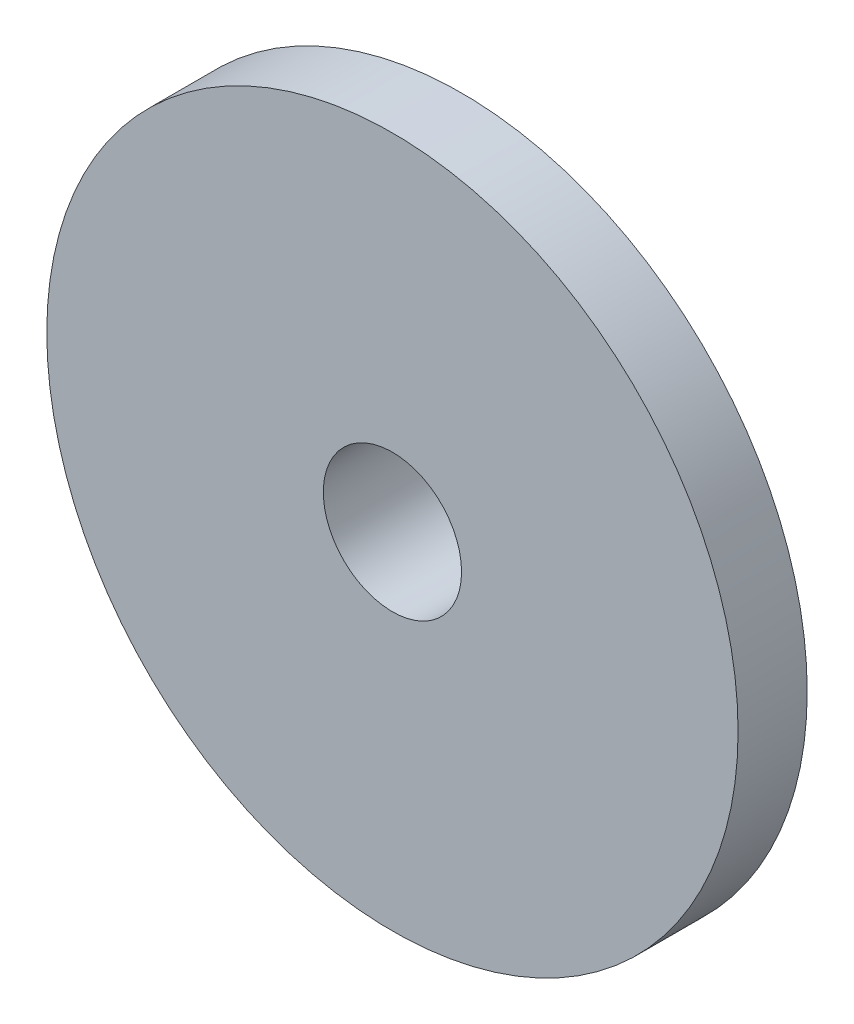
ISO-10303-21;
HEADER;
FILE_DESCRIPTION(('STEP AP214'),'2;1');
FILE_NAME('part.step','',(''),(''),'','','');
FILE_SCHEMA(('AUTOMOTIVE_DESIGN { 1 0 10303 214 1 1 1 1 }'));
ENDSEC;
DATA;
#1=APPLICATION_CONTEXT('core data for automotive mechanical design processes');
#2=APPLICATION_PROTOCOL_DEFINITION('international standard','automotive_design',2000,#1);
#3=PRODUCT_CONTEXT('',#1,'mechanical');
#4=PRODUCT('Part','Part','',(#3));
#5=PRODUCT_RELATED_PRODUCT_CATEGORY('part','',(#4));
#6=PRODUCT_DEFINITION_FORMATION('','',#4);
#7=PRODUCT_DEFINITION_CONTEXT('part definition',#1,'design');
#8=PRODUCT_DEFINITION('design','',#6,#7);
#9=PRODUCT_DEFINITION_SHAPE('','',#8);
#10=(LENGTH_UNIT() NAMED_UNIT(*) SI_UNIT(.MILLI.,.METRE.));
#11=(NAMED_UNIT(*) PLANE_ANGLE_UNIT() SI_UNIT($,.RADIAN.));
#12=(NAMED_UNIT(*) SI_UNIT($,.STERADIAN.) SOLID_ANGLE_UNIT());
#13=UNCERTAINTY_MEASURE_WITH_UNIT(LENGTH_MEASURE(1.E-05),#10,'distance_accuracy_value','');
#14=(GEOMETRIC_REPRESENTATION_CONTEXT(3) GLOBAL_UNCERTAINTY_ASSIGNED_CONTEXT((#13)) GLOBAL_UNIT_ASSIGNED_CONTEXT((#10,
#11,#12)) REPRESENTATION_CONTEXT('',''));
#15=CARTESIAN_POINT('',(0.,0.,0.));
#16=DIRECTION('',(0.,0.,1.));
#17=DIRECTION('',(1.,0.,0.));
#18=AXIS2_PLACEMENT_3D('',#15,#16,#17);
#19=CARTESIAN_POINT('',(0.,0.,0.));
#20=DIRECTION('',(0.,0.,1.));
#21=DIRECTION('',(1.,0.,0.));
#22=AXIS2_PLACEMENT_3D('',#19,#20,#21);
#23=PLANE('',#22);
#24=CARTESIAN_POINT('',(0.,0.,0.));
#25=DIRECTION('',(0.,0.,1.));
#26=DIRECTION('',(1.,0.,0.));
#27=AXIS2_PLACEMENT_3D('',#24,#25,#26);
#28=CIRCLE('',#27,3.5);
#29=CARTESIAN_POINT('',(3.5,0.,0.));
#30=VERTEX_POINT('',#29);
#31=EDGE_CURVE('E35',#30,#30,#28,.T.);
#32=ORIENTED_EDGE('',*,*,#31,.F.);
#33=EDGE_LOOP('',(#32));
#34=FACE_BOUND('',#33,.T.);
#35=CARTESIAN_POINT('',(0.,0.,0.));
#36=DIRECTION('',(0.,0.,1.));
#37=DIRECTION('',(1.,0.,0.));
#38=AXIS2_PLACEMENT_3D('',#35,#36,#37);
#39=CIRCLE('',#38,1.5);
#40=CARTESIAN_POINT('',(1.5,0.,0.));
#41=VERTEX_POINT('',#40);
#42=EDGE_CURVE('E42',#41,#41,#39,.T.);
#43=ORIENTED_EDGE('',*,*,#42,.T.);
#44=EDGE_LOOP('',(#43));
#45=FACE_BOUND('',#44,.T.);
#46=ADVANCED_FACE('F31',(#34,#45),#23,.F.);
#47=CARTESIAN_POINT('',(0.,0.,1.));
#48=DIRECTION('',(0.,0.,-1.));
#49=DIRECTION('',(-1.,0.,0.));
#50=AXIS2_PLACEMENT_3D('',#47,#48,#49);
#51=CYLINDRICAL_SURFACE('',#50,3.5);
#52=CARTESIAN_POINT('',(0.,0.,1.));
#53=DIRECTION('',(0.,0.,1.));
#54=DIRECTION('',(1.,0.,0.));
#55=AXIS2_PLACEMENT_3D('',#52,#53,#54);
#56=CIRCLE('',#55,3.5);
#57=CARTESIAN_POINT('',(3.5,0.,1.));
#58=VERTEX_POINT('',#57);
#59=EDGE_CURVE('E10',#58,#58,#56,.T.);
#60=ORIENTED_EDGE('',*,*,#59,.F.);
#61=EDGE_LOOP('',(#60));
#62=FACE_BOUND('',#61,.T.);
#63=ORIENTED_EDGE('',*,*,#31,.T.);
#64=EDGE_LOOP('',(#63));
#65=FACE_BOUND('',#64,.T.);
#66=ADVANCED_FACE('F33',(#62,#65),#51,.T.);
#67=CARTESIAN_POINT('',(0.,0.,1.));
#68=DIRECTION('',(0.,0.,-1.));
#69=DIRECTION('',(-1.,0.,0.));
#70=AXIS2_PLACEMENT_3D('',#67,#68,#69);
#71=CYLINDRICAL_SURFACE('',#70,1.5);
#72=ORIENTED_EDGE('',*,*,#42,.F.);
#73=EDGE_LOOP('',(#72));
#74=FACE_BOUND('',#73,.T.);
#75=CARTESIAN_POINT('',(0.,0.,2.5));
#76=DIRECTION('',(0.,0.,1.));
#77=DIRECTION('',(1.,0.,0.));
#78=AXIS2_PLACEMENT_3D('',#75,#76,#77);
#79=CIRCLE('',#78,1.5);
#80=CARTESIAN_POINT('',(1.5,0.,2.5));
#81=VERTEX_POINT('',#80);
#82=EDGE_CURVE('E50',#81,#81,#79,.T.);
#83=ORIENTED_EDGE('',*,*,#82,.T.);
#84=EDGE_LOOP('',(#83));
#85=FACE_BOUND('',#84,.T.);
#86=ADVANCED_FACE('F56',(#74,#85),#71,.F.);
#87=CARTESIAN_POINT('',(0.,0.,1.));
#88=DIRECTION('',(0.,0.,1.));
#89=DIRECTION('',(1.,0.,0.));
#90=AXIS2_PLACEMENT_3D('',#87,#88,#89);
#91=PLANE('',#90);
#92=CARTESIAN_POINT('',(0.,0.,1.));
#93=DIRECTION('',(0.,0.,1.));
#94=DIRECTION('',(1.,0.,0.));
#95=AXIS2_PLACEMENT_3D('',#92,#93,#94);
#96=CIRCLE('',#95,7.5);
#97=CARTESIAN_POINT('',(7.5,0.,1.));
#98=VERTEX_POINT('',#97);
#99=EDGE_CURVE('E47',#98,#98,#96,.T.);
#100=ORIENTED_EDGE('',*,*,#99,.F.);
#101=EDGE_LOOP('',(#100));
#102=FACE_BOUND('',#101,.T.);
#103=ORIENTED_EDGE('',*,*,#59,.T.);
#104=EDGE_LOOP('',(#103));
#105=FACE_BOUND('',#104,.T.);
#106=ADVANCED_FACE('F61',(#102,#105),#91,.F.);
#107=CARTESIAN_POINT('',(0.,0.,2.5));
#108=DIRECTION('',(0.,0.,1.));
#109=DIRECTION('',(1.,0.,0.));
#110=AXIS2_PLACEMENT_3D('',#107,#108,#109);
#111=PLANE('',#110);
#112=CARTESIAN_POINT('',(0.,0.,2.5));
#113=DIRECTION('',(0.,0.,1.));
#114=DIRECTION('',(1.,0.,0.));
#115=AXIS2_PLACEMENT_3D('',#112,#113,#114);
#116=CIRCLE('',#115,7.5);
#117=CARTESIAN_POINT('',(7.5,0.,2.5));
#118=VERTEX_POINT('',#117);
#119=EDGE_CURVE('E46',#118,#118,#116,.T.);
#120=ORIENTED_EDGE('',*,*,#119,.T.);
#121=EDGE_LOOP('',(#120));
#122=FACE_BOUND('',#121,.T.);
#123=ORIENTED_EDGE('',*,*,#82,.F.);
#124=EDGE_LOOP('',(#123));
#125=FACE_BOUND('',#124,.T.);
#126=ADVANCED_FACE('F58',(#122,#125),#111,.T.);
#127=CARTESIAN_POINT('',(0.,0.,2.5));
#128=DIRECTION('',(0.,0.,-1.));
#129=DIRECTION('',(-1.,0.,0.));
#130=AXIS2_PLACEMENT_3D('',#127,#128,#129);
#131=CYLINDRICAL_SURFACE('',#130,7.5);
#132=ORIENTED_EDGE('',*,*,#119,.F.);
#133=EDGE_LOOP('',(#132));
#134=FACE_BOUND('',#133,.T.);
#135=ORIENTED_EDGE('',*,*,#99,.T.);
#136=EDGE_LOOP('',(#135));
#137=FACE_BOUND('',#136,.T.);
#138=ADVANCED_FACE('F60',(#134,#137),#131,.T.);
#139=CLOSED_SHELL('',(#46,#66,#86,#106,#126,#138));
#140=MANIFOLD_SOLID_BREP('B2',#139);
#141=ADVANCED_BREP_SHAPE_REPRESENTATION('',(#18,#140),#14);
#142=SHAPE_DEFINITION_REPRESENTATION(#9,#141);
ENDSEC;
END-ISO-10303-21;
